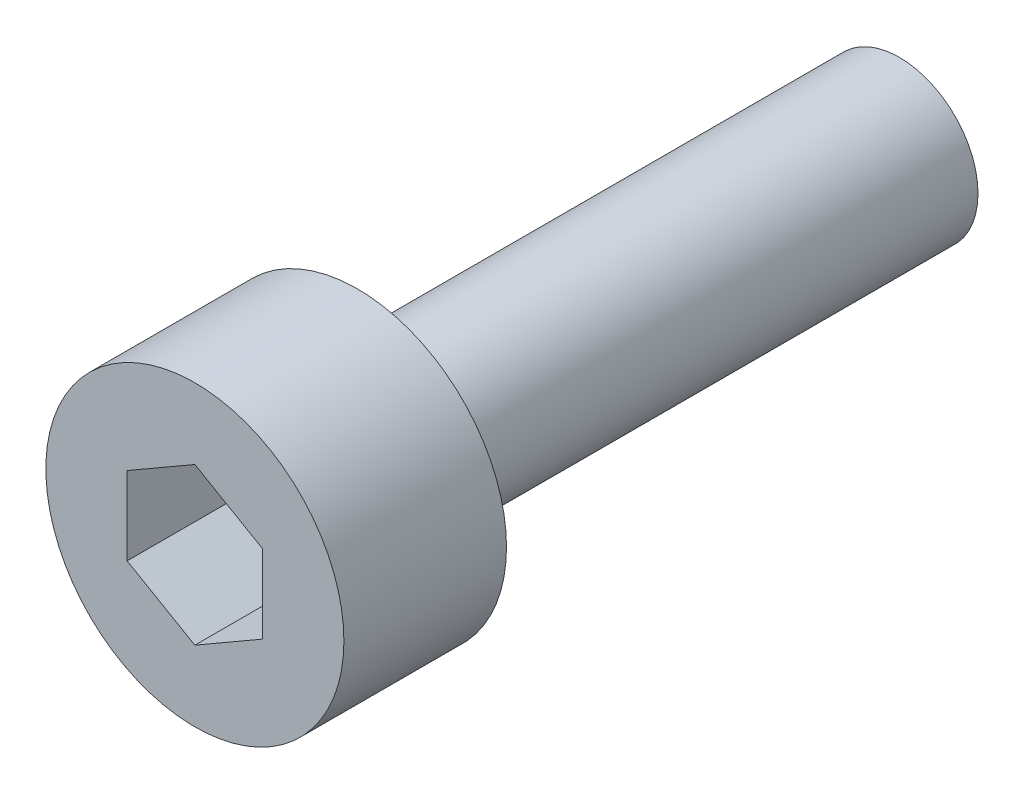
ISO-10303-21;
HEADER;
FILE_DESCRIPTION(('STEP AP214'),'2;1');
FILE_NAME('part.step','',(''),(''),'','','');
FILE_SCHEMA(('AUTOMOTIVE_DESIGN { 1 0 10303 214 1 1 1 1 }'));
ENDSEC;
DATA;
#1=APPLICATION_CONTEXT('core data for automotive mechanical design processes');
#2=APPLICATION_PROTOCOL_DEFINITION('international standard','automotive_design',2000,#1);
#3=PRODUCT_CONTEXT('',#1,'mechanical');
#4=PRODUCT('Part','Part','',(#3));
#5=PRODUCT_RELATED_PRODUCT_CATEGORY('part','',(#4));
#6=PRODUCT_DEFINITION_FORMATION('','',#4);
#7=PRODUCT_DEFINITION_CONTEXT('part definition',#1,'design');
#8=PRODUCT_DEFINITION('design','',#6,#7);
#9=PRODUCT_DEFINITION_SHAPE('','',#8);
#10=(LENGTH_UNIT() NAMED_UNIT(*) SI_UNIT(.MILLI.,.METRE.));
#11=(NAMED_UNIT(*) PLANE_ANGLE_UNIT() SI_UNIT($,.RADIAN.));
#12=(NAMED_UNIT(*) SI_UNIT($,.STERADIAN.) SOLID_ANGLE_UNIT());
#13=UNCERTAINTY_MEASURE_WITH_UNIT(LENGTH_MEASURE(1.E-05),#10,'distance_accuracy_value','');
#14=(GEOMETRIC_REPRESENTATION_CONTEXT(3) GLOBAL_UNCERTAINTY_ASSIGNED_CONTEXT((#13)) GLOBAL_UNIT_ASSIGNED_CONTEXT((#10,
#11,#12)) REPRESENTATION_CONTEXT('',''));
#15=CARTESIAN_POINT('',(0.,0.,0.));
#16=DIRECTION('',(0.,0.,1.));
#17=DIRECTION('',(1.,0.,0.));
#18=AXIS2_PLACEMENT_3D('',#15,#16,#17);
#19=CARTESIAN_POINT('',(0.,0.,-10.));
#20=DIRECTION('',(0.,0.,1.));
#21=DIRECTION('',(1.,0.,0.));
#22=AXIS2_PLACEMENT_3D('',#19,#20,#21);
#23=CYLINDRICAL_SURFACE('',#22,1.45);
#24=CARTESIAN_POINT('',(0.,0.,-10.));
#25=DIRECTION('',(0.,0.,1.));
#26=DIRECTION('',(1.,0.,0.));
#27=AXIS2_PLACEMENT_3D('',#24,#25,#26);
#28=CIRCLE('',#27,1.45);
#29=CARTESIAN_POINT('',(1.45,0.,-10.));
#30=VERTEX_POINT('',#29);
#31=EDGE_CURVE('E11',#30,#30,#28,.T.);
#32=ORIENTED_EDGE('',*,*,#31,.T.);
#33=EDGE_LOOP('',(#32));
#34=FACE_BOUND('',#33,.T.);
#35=CARTESIAN_POINT('',(0.,0.,0.));
#36=DIRECTION('',(0.,0.,1.));
#37=DIRECTION('',(1.,0.,0.));
#38=AXIS2_PLACEMENT_3D('',#35,#36,#37);
#39=CIRCLE('',#38,1.45);
#40=CARTESIAN_POINT('',(1.45,0.,0.));
#41=VERTEX_POINT('',#40);
#42=EDGE_CURVE('E44',#41,#41,#39,.T.);
#43=ORIENTED_EDGE('',*,*,#42,.F.);
#44=EDGE_LOOP('',(#43));
#45=FACE_BOUND('',#44,.T.);
#46=ADVANCED_FACE('F41',(#34,#45),#23,.T.);
#47=CARTESIAN_POINT('',(0.,0.,-10.));
#48=DIRECTION('',(0.,0.,1.));
#49=DIRECTION('',(1.,0.,0.));
#50=AXIS2_PLACEMENT_3D('',#47,#48,#49);
#51=PLANE('',#50);
#52=ORIENTED_EDGE('',*,*,#31,.F.);
#53=EDGE_LOOP('',(#52));
#54=FACE_BOUND('',#53,.T.);
#55=ADVANCED_FACE('F174',(#54),#51,.F.);
#56=CARTESIAN_POINT('',(0.,0.,3.));
#57=DIRECTION('',(0.,0.,-1.));
#58=DIRECTION('',(-1.,0.,0.));
#59=AXIS2_PLACEMENT_3D('',#56,#57,#58);
#60=CYLINDRICAL_SURFACE('',#59,2.75);
#61=CARTESIAN_POINT('',(0.,0.,3.));
#62=DIRECTION('',(0.,0.,1.));
#63=DIRECTION('',(1.,0.,0.));
#64=AXIS2_PLACEMENT_3D('',#61,#62,#63);
#65=CIRCLE('',#64,2.75);
#66=CARTESIAN_POINT('',(2.75,0.,3.));
#67=VERTEX_POINT('',#66);
#68=EDGE_CURVE('E148',#67,#67,#65,.T.);
#69=ORIENTED_EDGE('',*,*,#68,.F.);
#70=EDGE_LOOP('',(#69));
#71=FACE_BOUND('',#70,.T.);
#72=CARTESIAN_POINT('',(0.,0.,0.));
#73=DIRECTION('',(0.,0.,1.));
#74=DIRECTION('',(1.,0.,0.));
#75=AXIS2_PLACEMENT_3D('',#72,#73,#74);
#76=CIRCLE('',#75,2.75);
#77=CARTESIAN_POINT('',(2.75,0.,0.));
#78=VERTEX_POINT('',#77);
#79=EDGE_CURVE('E142',#78,#78,#76,.T.);
#80=ORIENTED_EDGE('',*,*,#79,.T.);
#81=EDGE_LOOP('',(#80));
#82=FACE_BOUND('',#81,.T.);
#83=ADVANCED_FACE('F154',(#71,#82),#60,.T.);
#84=CARTESIAN_POINT('',(0.,0.,3.));
#85=DIRECTION('',(0.,0.,1.));
#86=DIRECTION('',(1.,0.,0.));
#87=AXIS2_PLACEMENT_3D('',#84,#85,#86);
#88=PLANE('',#87);
#89=DIRECTION('',(0.,1.,0.));
#90=VECTOR('',#89,1.);
#91=CARTESIAN_POINT('',(1.25,-0.721687836487032,3.));
#92=LINE('',#91,#90);
#93=CARTESIAN_POINT('',(1.25,-0.721687836487032,3.));
#94=VERTEX_POINT('',#93);
#95=CARTESIAN_POINT('',(1.25,0.721687836487032,3.));
#96=VERTEX_POINT('',#95);
#97=EDGE_CURVE('E55',#94,#96,#92,.T.);
#98=ORIENTED_EDGE('',*,*,#97,.F.);
#99=DIRECTION('',(0.866025403784438,0.5,0.));
#100=VECTOR('',#99,1.);
#101=CARTESIAN_POINT('',(0.,-1.44337567297406,3.));
#102=LINE('',#101,#100);
#103=CARTESIAN_POINT('',(0.,-1.44337567297406,3.));
#104=VERTEX_POINT('',#103);
#105=EDGE_CURVE('E138',#104,#94,#102,.T.);
#106=ORIENTED_EDGE('',*,*,#105,.F.);
#107=DIRECTION('',(0.866025403784438,-0.5,0.));
#108=VECTOR('',#107,1.);
#109=CARTESIAN_POINT('',(-1.25,-0.721687836487032,3.));
#110=LINE('',#109,#108);
#111=CARTESIAN_POINT('',(-1.25,-0.721687836487032,3.));
#112=VERTEX_POINT('',#111);
#113=EDGE_CURVE('E136',#112,#104,#110,.T.);
#114=ORIENTED_EDGE('',*,*,#113,.F.);
#115=DIRECTION('',(0.,-1.,0.));
#116=VECTOR('',#115,1.);
#117=CARTESIAN_POINT('',(-1.25,0.721687836487033,3.));
#118=LINE('',#117,#116);
#119=CARTESIAN_POINT('',(-1.25,0.721687836487033,3.));
#120=VERTEX_POINT('',#119);
#121=EDGE_CURVE('E103',#120,#112,#118,.T.);
#122=ORIENTED_EDGE('',*,*,#121,.F.);
#123=DIRECTION('',(-0.866025403784439,-0.5,0.));
#124=VECTOR('',#123,1.);
#125=CARTESIAN_POINT('',(0.,1.44337567297406,3.));
#126=LINE('',#125,#124);
#127=CARTESIAN_POINT('',(0.,1.44337567297406,3.));
#128=VERTEX_POINT('',#127);
#129=EDGE_CURVE('E132',#128,#120,#126,.T.);
#130=ORIENTED_EDGE('',*,*,#129,.F.);
#131=DIRECTION('',(-0.866025403784439,0.5,0.));
#132=VECTOR('',#131,1.);
#133=CARTESIAN_POINT('',(1.25,0.721687836487032,3.));
#134=LINE('',#133,#132);
#135=EDGE_CURVE('E129',#96,#128,#134,.T.);
#136=ORIENTED_EDGE('',*,*,#135,.F.);
#137=EDGE_LOOP('',(#98,#106,#114,#122,#130,#136));
#138=FACE_BOUND('',#137,.T.);
#139=ORIENTED_EDGE('',*,*,#68,.T.);
#140=EDGE_LOOP('',(#139));
#141=FACE_BOUND('',#140,.T.);
#142=ADVANCED_FACE('F159',(#138,#141),#88,.T.);
#143=CARTESIAN_POINT('',(0.,0.,0.));
#144=DIRECTION('',(0.,0.,1.));
#145=DIRECTION('',(1.,0.,0.));
#146=AXIS2_PLACEMENT_3D('',#143,#144,#145);
#147=PLANE('',#146);
#148=ORIENTED_EDGE('',*,*,#42,.T.);
#149=EDGE_LOOP('',(#148));
#150=FACE_BOUND('',#149,.T.);
#151=ORIENTED_EDGE('',*,*,#79,.F.);
#152=EDGE_LOOP('',(#151));
#153=FACE_BOUND('',#152,.T.);
#154=ADVANCED_FACE('F156',(#150,#153),#147,.F.);
#155=CARTESIAN_POINT('',(1.25,-0.721687836487032,1.05));
#156=DIRECTION('',(1.,0.,0.));
#157=DIRECTION('',(0.,1.,0.));
#158=AXIS2_PLACEMENT_3D('',#155,#156,#157);
#159=PLANE('',#158);
#160=ORIENTED_EDGE('',*,*,#97,.T.);
#161=DIRECTION('',(0.,0.,1.));
#162=VECTOR('',#161,1.);
#163=CARTESIAN_POINT('',(1.25,0.721687836487032,1.05));
#164=LINE('',#163,#162);
#165=CARTESIAN_POINT('',(1.25,0.721687836487032,1.05));
#166=VERTEX_POINT('',#165);
#167=EDGE_CURVE('E85',#166,#96,#164,.T.);
#168=ORIENTED_EDGE('',*,*,#167,.F.);
#169=DIRECTION('',(0.,1.,0.));
#170=VECTOR('',#169,1.);
#171=CARTESIAN_POINT('',(1.25,-0.721687836487032,1.05));
#172=LINE('',#171,#170);
#173=CARTESIAN_POINT('',(1.25,-0.721687836487032,1.05));
#174=VERTEX_POINT('',#173);
#175=EDGE_CURVE('E140',#174,#166,#172,.T.);
#176=ORIENTED_EDGE('',*,*,#175,.F.);
#177=DIRECTION('',(0.,0.,1.));
#178=VECTOR('',#177,1.);
#179=CARTESIAN_POINT('',(1.25,-0.721687836487032,1.05));
#180=LINE('',#179,#178);
#181=EDGE_CURVE('E63',#174,#94,#180,.T.);
#182=ORIENTED_EDGE('',*,*,#181,.T.);
#183=EDGE_LOOP('',(#160,#168,#176,#182));
#184=FACE_BOUND('',#183,.T.);
#185=ADVANCED_FACE('F158',(#184),#159,.F.);
#186=CARTESIAN_POINT('',(0.,-1.44337567297406,1.05));
#187=DIRECTION('',(0.5,-0.866025403784438,0.));
#188=DIRECTION('',(0.866025403784439,0.5,0.));
#189=AXIS2_PLACEMENT_3D('',#186,#187,#188);
#190=PLANE('',#189);
#191=ORIENTED_EDGE('',*,*,#105,.T.);
#192=ORIENTED_EDGE('',*,*,#181,.F.);
#193=DIRECTION('',(0.866025403784438,0.5,0.));
#194=VECTOR('',#193,1.);
#195=CARTESIAN_POINT('',(0.,-1.44337567297406,1.05));
#196=LINE('',#195,#194);
#197=CARTESIAN_POINT('',(0.,-1.44337567297406,1.05));
#198=VERTEX_POINT('',#197);
#199=EDGE_CURVE('E115',#198,#174,#196,.T.);
#200=ORIENTED_EDGE('',*,*,#199,.F.);
#201=DIRECTION('',(0.,0.,1.));
#202=VECTOR('',#201,1.);
#203=CARTESIAN_POINT('',(0.,-1.44337567297406,1.05));
#204=LINE('',#203,#202);
#205=EDGE_CURVE('E107',#198,#104,#204,.T.);
#206=ORIENTED_EDGE('',*,*,#205,.T.);
#207=EDGE_LOOP('',(#191,#192,#200,#206));
#208=FACE_BOUND('',#207,.T.);
#209=ADVANCED_FACE('F167',(#208),#190,.F.);
#210=CARTESIAN_POINT('',(-1.25,-0.721687836487032,1.05));
#211=DIRECTION('',(-0.5,-0.866025403784438,0.));
#212=DIRECTION('',(0.866025403784439,-0.5,0.));
#213=AXIS2_PLACEMENT_3D('',#210,#211,#212);
#214=PLANE('',#213);
#215=ORIENTED_EDGE('',*,*,#113,.T.);
#216=ORIENTED_EDGE('',*,*,#205,.F.);
#217=DIRECTION('',(0.866025403784438,-0.5,0.));
#218=VECTOR('',#217,1.);
#219=CARTESIAN_POINT('',(-1.25,-0.721687836487032,1.05));
#220=LINE('',#219,#218);
#221=CARTESIAN_POINT('',(-1.25,-0.721687836487032,1.05));
#222=VERTEX_POINT('',#221);
#223=EDGE_CURVE('E111',#222,#198,#220,.T.);
#224=ORIENTED_EDGE('',*,*,#223,.F.);
#225=DIRECTION('',(0.,0.,1.));
#226=VECTOR('',#225,1.);
#227=CARTESIAN_POINT('',(-1.25,-0.721687836487032,1.05));
#228=LINE('',#227,#226);
#229=EDGE_CURVE('E96',#222,#112,#228,.T.);
#230=ORIENTED_EDGE('',*,*,#229,.T.);
#231=EDGE_LOOP('',(#215,#216,#224,#230));
#232=FACE_BOUND('',#231,.T.);
#233=ADVANCED_FACE('F112',(#232),#214,.F.);
#234=CARTESIAN_POINT('',(-1.25,0.721687836487033,1.05));
#235=DIRECTION('',(-1.,0.,0.));
#236=DIRECTION('',(0.,-1.,0.));
#237=AXIS2_PLACEMENT_3D('',#234,#235,#236);
#238=PLANE('',#237);
#239=ORIENTED_EDGE('',*,*,#121,.T.);
#240=ORIENTED_EDGE('',*,*,#229,.F.);
#241=DIRECTION('',(0.,-1.,0.));
#242=VECTOR('',#241,1.);
#243=CARTESIAN_POINT('',(-1.25,0.721687836487033,1.05));
#244=LINE('',#243,#242);
#245=CARTESIAN_POINT('',(-1.25,0.721687836487033,1.05));
#246=VERTEX_POINT('',#245);
#247=EDGE_CURVE('E100',#246,#222,#244,.T.);
#248=ORIENTED_EDGE('',*,*,#247,.F.);
#249=DIRECTION('',(0.,0.,1.));
#250=VECTOR('',#249,1.);
#251=CARTESIAN_POINT('',(-1.25,0.721687836487033,1.05));
#252=LINE('',#251,#250);
#253=EDGE_CURVE('E108',#246,#120,#252,.T.);
#254=ORIENTED_EDGE('',*,*,#253,.T.);
#255=EDGE_LOOP('',(#239,#240,#248,#254));
#256=FACE_BOUND('',#255,.T.);
#257=ADVANCED_FACE('F98',(#256),#238,.F.);
#258=CARTESIAN_POINT('',(0.,1.44337567297406,1.05));
#259=DIRECTION('',(-0.5,0.866025403784439,0.));
#260=DIRECTION('',(-0.866025403784439,-0.5,0.));
#261=AXIS2_PLACEMENT_3D('',#258,#259,#260);
#262=PLANE('',#261);
#263=ORIENTED_EDGE('',*,*,#129,.T.);
#264=ORIENTED_EDGE('',*,*,#253,.F.);
#265=DIRECTION('',(-0.866025403784439,-0.5,0.));
#266=VECTOR('',#265,1.);
#267=CARTESIAN_POINT('',(0.,1.44337567297406,1.05));
#268=LINE('',#267,#266);
#269=CARTESIAN_POINT('',(0.,1.44337567297406,1.05));
#270=VERTEX_POINT('',#269);
#271=EDGE_CURVE('E121',#270,#246,#268,.T.);
#272=ORIENTED_EDGE('',*,*,#271,.F.);
#273=DIRECTION('',(0.,0.,1.));
#274=VECTOR('',#273,1.);
#275=CARTESIAN_POINT('',(0.,1.44337567297406,1.05));
#276=LINE('',#275,#274);
#277=EDGE_CURVE('E145',#270,#128,#276,.T.);
#278=ORIENTED_EDGE('',*,*,#277,.T.);
#279=EDGE_LOOP('',(#263,#264,#272,#278));
#280=FACE_BOUND('',#279,.T.);
#281=ADVANCED_FACE('F235',(#280),#262,.F.);
#282=CARTESIAN_POINT('',(1.25,0.721687836487032,1.05));
#283=DIRECTION('',(0.5,0.866025403784439,0.));
#284=DIRECTION('',(-0.866025403784439,0.5,0.));
#285=AXIS2_PLACEMENT_3D('',#282,#283,#284);
#286=PLANE('',#285);
#287=ORIENTED_EDGE('',*,*,#135,.T.);
#288=ORIENTED_EDGE('',*,*,#277,.F.);
#289=DIRECTION('',(-0.866025403784439,0.5,0.));
#290=VECTOR('',#289,1.);
#291=CARTESIAN_POINT('',(1.25,0.721687836487032,1.05));
#292=LINE('',#291,#290);
#293=EDGE_CURVE('E123',#166,#270,#292,.T.);
#294=ORIENTED_EDGE('',*,*,#293,.F.);
#295=ORIENTED_EDGE('',*,*,#167,.T.);
#296=EDGE_LOOP('',(#287,#288,#294,#295));
#297=FACE_BOUND('',#296,.T.);
#298=ADVANCED_FACE('F244',(#297),#286,.F.);
#299=CARTESIAN_POINT('',(0.,0.,1.05));
#300=DIRECTION('',(0.,0.,1.));
#301=DIRECTION('',(1.,0.,0.));
#302=AXIS2_PLACEMENT_3D('',#299,#300,#301);
#303=PLANE('',#302);
#304=ORIENTED_EDGE('',*,*,#175,.T.);
#305=ORIENTED_EDGE('',*,*,#293,.T.);
#306=ORIENTED_EDGE('',*,*,#271,.T.);
#307=ORIENTED_EDGE('',*,*,#247,.T.);
#308=ORIENTED_EDGE('',*,*,#223,.T.);
#309=ORIENTED_EDGE('',*,*,#199,.T.);
#310=EDGE_LOOP('',(#304,#305,#306,#307,#308,#309));
#311=FACE_BOUND('',#310,.T.);
#312=ADVANCED_FACE('F118',(#311),#303,.T.);
#313=CLOSED_SHELL('',(#46,#55,#83,#142,#154,#185,#209,#233,#257,#281,#298,#312));
#314=MANIFOLD_SOLID_BREP('B2',#313);
#315=ADVANCED_BREP_SHAPE_REPRESENTATION('',(#18,#314),#14);
#316=SHAPE_DEFINITION_REPRESENTATION(#9,#315);
ENDSEC;
END-ISO-10303-21;
